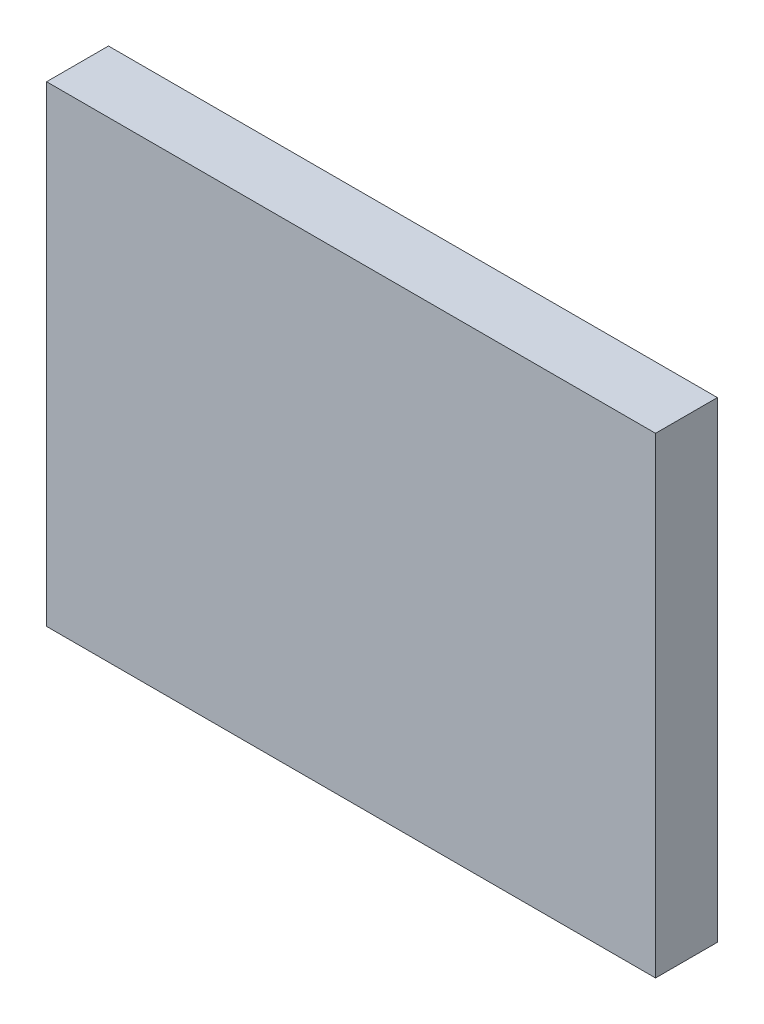
ISO-10303-21;
HEADER;
FILE_DESCRIPTION(('STEP AP214'),'2;1');
FILE_NAME('part.step','',(''),(''),'','','');
FILE_SCHEMA(('AUTOMOTIVE_DESIGN { 1 0 10303 214 1 1 1 1 }'));
ENDSEC;
DATA;
#1=APPLICATION_CONTEXT('core data for automotive mechanical design processes');
#2=APPLICATION_PROTOCOL_DEFINITION('international standard','automotive_design',2000,#1);
#3=PRODUCT_CONTEXT('',#1,'mechanical');
#4=PRODUCT('Part','Part','',(#3));
#5=PRODUCT_RELATED_PRODUCT_CATEGORY('part','',(#4));
#6=PRODUCT_DEFINITION_FORMATION('','',#4);
#7=PRODUCT_DEFINITION_CONTEXT('part definition',#1,'design');
#8=PRODUCT_DEFINITION('design','',#6,#7);
#9=PRODUCT_DEFINITION_SHAPE('','',#8);
#10=(LENGTH_UNIT() NAMED_UNIT(*) SI_UNIT(.MILLI.,.METRE.));
#11=(NAMED_UNIT(*) PLANE_ANGLE_UNIT() SI_UNIT($,.RADIAN.));
#12=(NAMED_UNIT(*) SI_UNIT($,.STERADIAN.) SOLID_ANGLE_UNIT());
#13=UNCERTAINTY_MEASURE_WITH_UNIT(LENGTH_MEASURE(1.E-05),#10,'distance_accuracy_value','');
#14=(GEOMETRIC_REPRESENTATION_CONTEXT(3) GLOBAL_UNCERTAINTY_ASSIGNED_CONTEXT((#13)) GLOBAL_UNIT_ASSIGNED_CONTEXT((#10,
#11,#12)) REPRESENTATION_CONTEXT('',''));
#15=CARTESIAN_POINT('',(0.,0.,0.));
#16=DIRECTION('',(0.,0.,1.));
#17=DIRECTION('',(1.,0.,0.));
#18=AXIS2_PLACEMENT_3D('',#15,#16,#17);
#19=CARTESIAN_POINT('',(-3.75,-2.354987299975,0.762001524003));
#20=DIRECTION('',(0.,0.,1.));
#21=DIRECTION('',(1.,0.,0.));
#22=AXIS2_PLACEMENT_3D('',#19,#20,#21);
#23=PLANE('',#22);
#24=DIRECTION('',(0.,-1.,0.));
#25=VECTOR('',#24,1.);
#26=CARTESIAN_POINT('',(3.75,0.550012700025,0.762001524003));
#27=LINE('',#26,#25);
#28=CARTESIAN_POINT('',(3.75,3.455012700025,0.762001524003));
#29=VERTEX_POINT('',#28);
#30=CARTESIAN_POINT('',(3.75,-2.354987299975,0.762001524003));
#31=VERTEX_POINT('',#30);
#32=EDGE_CURVE('E77',#29,#31,#27,.T.);
#33=ORIENTED_EDGE('',*,*,#32,.F.);
#34=DIRECTION('',(1.,0.,0.));
#35=VECTOR('',#34,1.);
#36=CARTESIAN_POINT('',(0.,3.455012700025,0.762001524003));
#37=LINE('',#36,#35);
#38=CARTESIAN_POINT('',(-3.75,3.455012700025,0.762001524003));
#39=VERTEX_POINT('',#38);
#40=EDGE_CURVE('E59',#39,#29,#37,.T.);
#41=ORIENTED_EDGE('',*,*,#40,.F.);
#42=DIRECTION('',(0.,-1.,0.));
#43=VECTOR('',#42,1.);
#44=CARTESIAN_POINT('',(-3.75,0.550012700025,0.762001524003));
#45=LINE('',#44,#43);
#46=CARTESIAN_POINT('',(-3.75,-2.354987299975,0.762001524003));
#47=VERTEX_POINT('',#46);
#48=EDGE_CURVE('E21',#39,#47,#45,.T.);
#49=ORIENTED_EDGE('',*,*,#48,.T.);
#50=DIRECTION('',(1.,0.,0.));
#51=VECTOR('',#50,1.);
#52=CARTESIAN_POINT('',(0.,-2.354987299975,0.762001524003));
#53=LINE('',#52,#51);
#54=EDGE_CURVE('E56',#47,#31,#53,.T.);
#55=ORIENTED_EDGE('',*,*,#54,.T.);
#56=EDGE_LOOP('',(#33,#41,#49,#55));
#57=FACE_BOUND('',#56,.T.);
#58=ADVANCED_FACE('F17',(#57),#23,.T.);
#59=CARTESIAN_POINT('',(-3.75,3.455012700025,0.));
#60=DIRECTION('',(1.,0.,0.));
#61=DIRECTION('',(0.,0.,1.));
#62=AXIS2_PLACEMENT_3D('',#59,#60,#61);
#63=PLANE('',#62);
#64=DIRECTION('',(0.,0.,1.));
#65=VECTOR('',#64,1.);
#66=CARTESIAN_POINT('',(-3.75,3.455012700025,0.3810007620015));
#67=LINE('',#66,#65);
#68=CARTESIAN_POINT('',(-3.75,3.455012700025,0.));
#69=VERTEX_POINT('',#68);
#70=EDGE_CURVE('E79',#69,#39,#67,.T.);
#71=ORIENTED_EDGE('',*,*,#70,.F.);
#72=DIRECTION('',(0.,-1.,0.));
#73=VECTOR('',#72,1.);
#74=CARTESIAN_POINT('',(-3.75,0.550012700025,0.));
#75=LINE('',#74,#73);
#76=CARTESIAN_POINT('',(-3.75,-2.354987299975,0.));
#77=VERTEX_POINT('',#76);
#78=EDGE_CURVE('E74',#69,#77,#75,.T.);
#79=ORIENTED_EDGE('',*,*,#78,.T.);
#80=DIRECTION('',(0.,0.,1.));
#81=VECTOR('',#80,1.);
#82=CARTESIAN_POINT('',(-3.75,-2.354987299975,0.3810007620015));
#83=LINE('',#82,#81);
#84=EDGE_CURVE('E64',#77,#47,#83,.T.);
#85=ORIENTED_EDGE('',*,*,#84,.T.);
#86=ORIENTED_EDGE('',*,*,#48,.F.);
#87=EDGE_LOOP('',(#71,#79,#85,#86));
#88=FACE_BOUND('',#87,.T.);
#89=ADVANCED_FACE('F73',(#88),#63,.F.);
#90=CARTESIAN_POINT('',(-3.75,-2.354987299975,0.));
#91=DIRECTION('',(0.,1.,0.));
#92=DIRECTION('',(0.,0.,1.));
#93=AXIS2_PLACEMENT_3D('',#90,#91,#92);
#94=PLANE('',#93);
#95=ORIENTED_EDGE('',*,*,#54,.F.);
#96=ORIENTED_EDGE('',*,*,#84,.F.);
#97=DIRECTION('',(1.,0.,0.));
#98=VECTOR('',#97,1.);
#99=CARTESIAN_POINT('',(0.,-2.354987299975,0.));
#100=LINE('',#99,#98);
#101=CARTESIAN_POINT('',(3.75,-2.354987299975,0.));
#102=VERTEX_POINT('',#101);
#103=EDGE_CURVE('E84',#77,#102,#100,.T.);
#104=ORIENTED_EDGE('',*,*,#103,.T.);
#105=DIRECTION('',(0.,0.,-1.));
#106=VECTOR('',#105,1.);
#107=CARTESIAN_POINT('',(3.75,-2.354987299975,0.3810007620015));
#108=LINE('',#107,#106);
#109=EDGE_CURVE('E70',#31,#102,#108,.T.);
#110=ORIENTED_EDGE('',*,*,#109,.F.);
#111=EDGE_LOOP('',(#95,#96,#104,#110));
#112=FACE_BOUND('',#111,.T.);
#113=ADVANCED_FACE('F67',(#112),#94,.F.);
#114=CARTESIAN_POINT('',(3.75,3.455012700025,0.));
#115=DIRECTION('',(1.,0.,0.));
#116=DIRECTION('',(0.,0.,1.));
#117=AXIS2_PLACEMENT_3D('',#114,#115,#116);
#118=PLANE('',#117);
#119=DIRECTION('',(0.,0.,-1.));
#120=VECTOR('',#119,1.);
#121=CARTESIAN_POINT('',(3.75,3.455012700025,0.3810007620015));
#122=LINE('',#121,#120);
#123=CARTESIAN_POINT('',(3.75,3.455012700025,0.));
#124=VERTEX_POINT('',#123);
#125=EDGE_CURVE('E35',#29,#124,#122,.T.);
#126=ORIENTED_EDGE('',*,*,#125,.F.);
#127=ORIENTED_EDGE('',*,*,#32,.T.);
#128=ORIENTED_EDGE('',*,*,#109,.T.);
#129=DIRECTION('',(0.,1.,0.));
#130=VECTOR('',#129,1.);
#131=CARTESIAN_POINT('',(3.75,0.550012700025,0.));
#132=LINE('',#131,#130);
#133=EDGE_CURVE('E27',#102,#124,#132,.T.);
#134=ORIENTED_EDGE('',*,*,#133,.T.);
#135=EDGE_LOOP('',(#126,#127,#128,#134));
#136=FACE_BOUND('',#135,.T.);
#137=ADVANCED_FACE('F89',(#136),#118,.T.);
#138=CARTESIAN_POINT('',(-3.75,3.455012700025,0.));
#139=DIRECTION('',(0.,1.,0.));
#140=DIRECTION('',(0.,0.,1.));
#141=AXIS2_PLACEMENT_3D('',#138,#139,#140);
#142=PLANE('',#141);
#143=ORIENTED_EDGE('',*,*,#40,.T.);
#144=ORIENTED_EDGE('',*,*,#125,.T.);
#145=DIRECTION('',(-1.,0.,0.));
#146=VECTOR('',#145,1.);
#147=CARTESIAN_POINT('',(0.,3.455012700025,0.));
#148=LINE('',#147,#146);
#149=EDGE_CURVE('E11',#124,#69,#148,.T.);
#150=ORIENTED_EDGE('',*,*,#149,.T.);
#151=ORIENTED_EDGE('',*,*,#70,.T.);
#152=EDGE_LOOP('',(#143,#144,#150,#151));
#153=FACE_BOUND('',#152,.T.);
#154=ADVANCED_FACE('F91',(#153),#142,.T.);
#155=CARTESIAN_POINT('',(-3.75,-2.354987299975,0.));
#156=DIRECTION('',(0.,0.,1.));
#157=DIRECTION('',(1.,0.,0.));
#158=AXIS2_PLACEMENT_3D('',#155,#156,#157);
#159=PLANE('',#158);
#160=ORIENTED_EDGE('',*,*,#133,.F.);
#161=ORIENTED_EDGE('',*,*,#103,.F.);
#162=ORIENTED_EDGE('',*,*,#78,.F.);
#163=ORIENTED_EDGE('',*,*,#149,.F.);
#164=EDGE_LOOP('',(#160,#161,#162,#163));
#165=FACE_BOUND('',#164,.T.);
#166=ADVANCED_FACE('F19',(#165),#159,.F.);
#167=CLOSED_SHELL('',(#58,#89,#113,#137,#154,#166));
#168=MANIFOLD_SOLID_BREP('B1',#167);
#169=ADVANCED_BREP_SHAPE_REPRESENTATION('',(#18,#168),#14);
#170=SHAPE_DEFINITION_REPRESENTATION(#9,#169);
ENDSEC;
END-ISO-10303-21;
